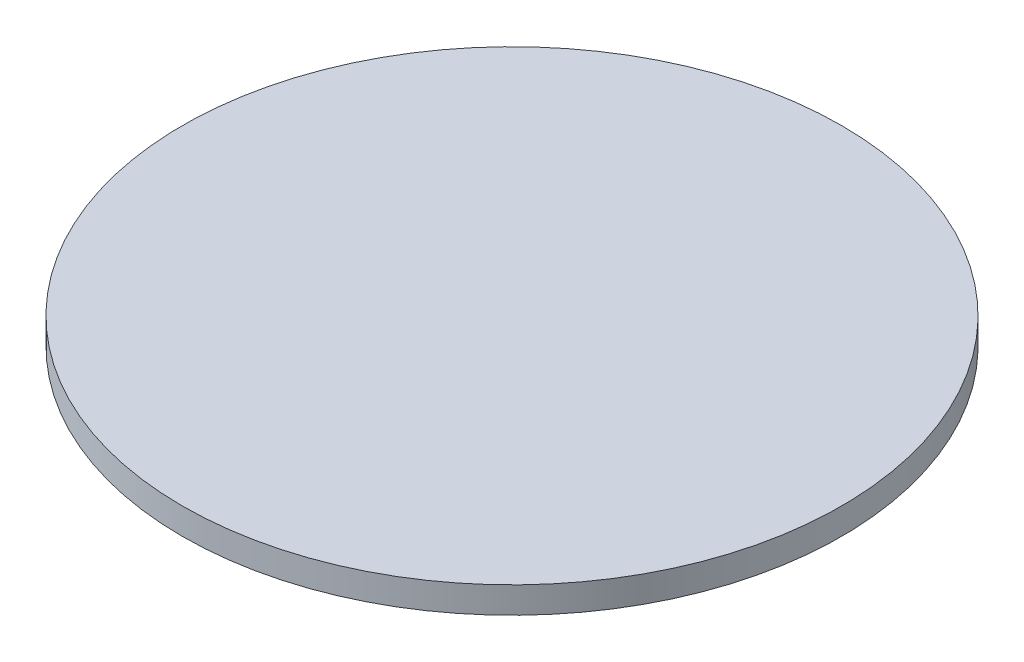
ISO-10303-21;
HEADER;
FILE_DESCRIPTION(('STEP AP214'),'2;1');
FILE_NAME('part.step','',(''),(''),'','','');
FILE_SCHEMA(('AUTOMOTIVE_DESIGN { 1 0 10303 214 1 1 1 1 }'));
ENDSEC;
DATA;
#1=APPLICATION_CONTEXT('core data for automotive mechanical design processes');
#2=APPLICATION_PROTOCOL_DEFINITION('international standard','automotive_design',2000,#1);
#3=PRODUCT_CONTEXT('',#1,'mechanical');
#4=PRODUCT('Part','Part','',(#3));
#5=PRODUCT_RELATED_PRODUCT_CATEGORY('part','',(#4));
#6=PRODUCT_DEFINITION_FORMATION('','',#4);
#7=PRODUCT_DEFINITION_CONTEXT('part definition',#1,'design');
#8=PRODUCT_DEFINITION('design','',#6,#7);
#9=PRODUCT_DEFINITION_SHAPE('','',#8);
#10=(LENGTH_UNIT() NAMED_UNIT(*) SI_UNIT(.MILLI.,.METRE.));
#11=(NAMED_UNIT(*) PLANE_ANGLE_UNIT() SI_UNIT($,.RADIAN.));
#12=(NAMED_UNIT(*) SI_UNIT($,.STERADIAN.) SOLID_ANGLE_UNIT());
#13=UNCERTAINTY_MEASURE_WITH_UNIT(LENGTH_MEASURE(1.E-05),#10,'distance_accuracy_value','');
#14=(GEOMETRIC_REPRESENTATION_CONTEXT(3) GLOBAL_UNCERTAINTY_ASSIGNED_CONTEXT((#13)) GLOBAL_UNIT_ASSIGNED_CONTEXT((#10,
#11,#12)) REPRESENTATION_CONTEXT('',''));
#15=CARTESIAN_POINT('',(0.,0.,0.));
#16=DIRECTION('',(0.,0.,1.));
#17=DIRECTION('',(1.,0.,0.));
#18=AXIS2_PLACEMENT_3D('',#15,#16,#17);
#19=CARTESIAN_POINT('',(0.,0.8,0.));
#20=DIRECTION('',(0.,-1.,0.));
#21=DIRECTION('',(0.,0.,-1.));
#22=AXIS2_PLACEMENT_3D('',#19,#20,#21);
#23=CYLINDRICAL_SURFACE('',#22,10.);
#24=CARTESIAN_POINT('',(0.,0.8,0.));
#25=DIRECTION('',(0.,1.,0.));
#26=DIRECTION('',(0.,0.,1.));
#27=AXIS2_PLACEMENT_3D('',#24,#25,#26);
#28=CIRCLE('',#27,10.);
#29=CARTESIAN_POINT('',(0.,0.8,10.));
#30=VERTEX_POINT('',#29);
#31=EDGE_CURVE('E10',#30,#30,#28,.T.);
#32=ORIENTED_EDGE('',*,*,#31,.F.);
#33=EDGE_LOOP('',(#32));
#34=FACE_BOUND('',#33,.T.);
#35=CARTESIAN_POINT('',(0.,0.,0.));
#36=DIRECTION('',(0.,1.,0.));
#37=DIRECTION('',(0.,0.,1.));
#38=AXIS2_PLACEMENT_3D('',#35,#36,#37);
#39=CIRCLE('',#38,10.);
#40=CARTESIAN_POINT('',(0.,0.,10.));
#41=VERTEX_POINT('',#40);
#42=EDGE_CURVE('E40',#41,#41,#39,.T.);
#43=ORIENTED_EDGE('',*,*,#42,.T.);
#44=EDGE_LOOP('',(#43));
#45=FACE_BOUND('',#44,.T.);
#46=ADVANCED_FACE('F37',(#34,#45),#23,.T.);
#47=CARTESIAN_POINT('',(0.,0.8,0.));
#48=DIRECTION('',(0.,1.,0.));
#49=DIRECTION('',(0.,0.,1.));
#50=AXIS2_PLACEMENT_3D('',#47,#48,#49);
#51=PLANE('',#50);
#52=ORIENTED_EDGE('',*,*,#31,.T.);
#53=EDGE_LOOP('',(#52));
#54=FACE_BOUND('',#53,.T.);
#55=ADVANCED_FACE('F54',(#54),#51,.T.);
#56=CARTESIAN_POINT('',(0.,0.,0.));
#57=DIRECTION('',(0.,1.,0.));
#58=DIRECTION('',(0.,0.,1.));
#59=AXIS2_PLACEMENT_3D('',#56,#57,#58);
#60=PLANE('',#59);
#61=ORIENTED_EDGE('',*,*,#42,.F.);
#62=EDGE_LOOP('',(#61));
#63=FACE_BOUND('',#62,.T.);
#64=ADVANCED_FACE('F52',(#63),#60,.F.);
#65=CLOSED_SHELL('',(#46,#55,#64));
#66=MANIFOLD_SOLID_BREP('B2',#65);
#67=ADVANCED_BREP_SHAPE_REPRESENTATION('',(#18,#66),#14);
#68=SHAPE_DEFINITION_REPRESENTATION(#9,#67);
ENDSEC;
END-ISO-10303-21;
